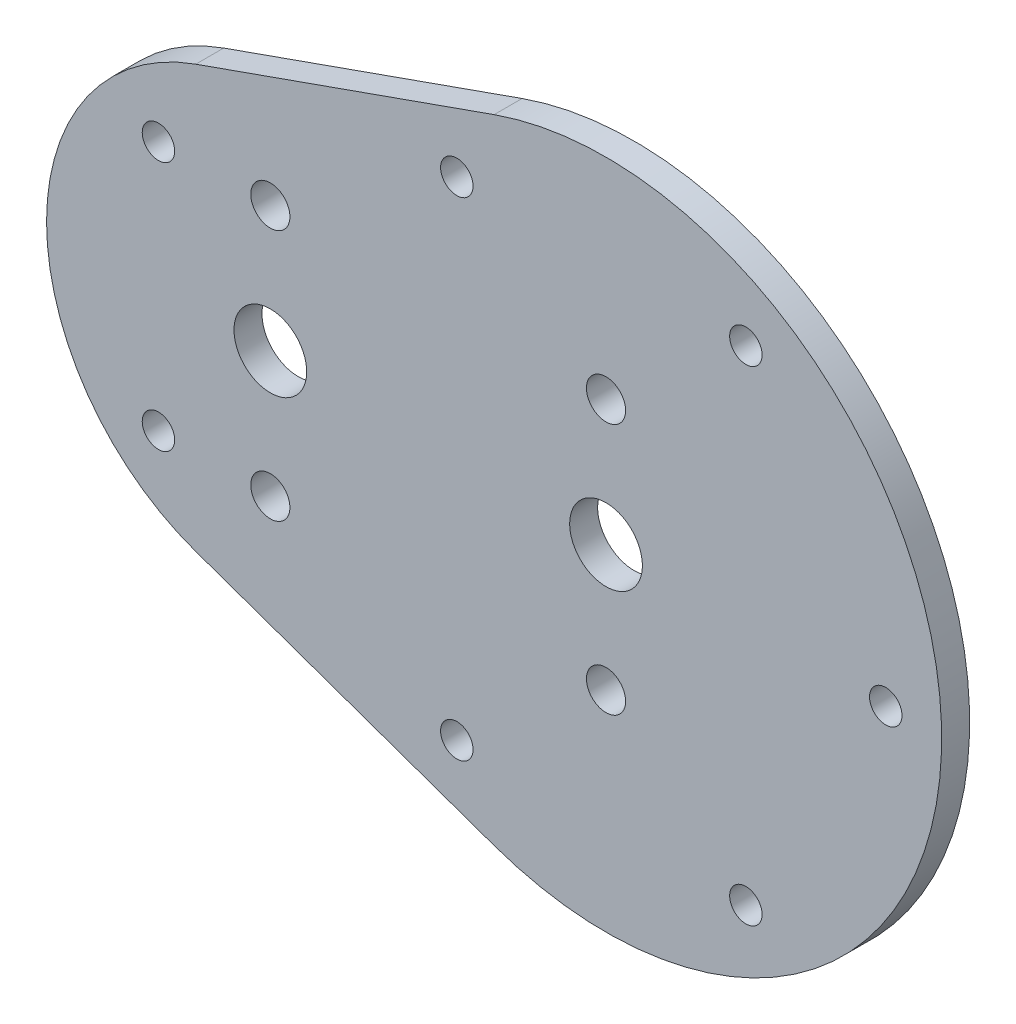
ISO-10303-21;
HEADER;
FILE_DESCRIPTION(('STEP AP214'),'2;1');
FILE_NAME('part.step','',(''),(''),'','','');
FILE_SCHEMA(('AUTOMOTIVE_DESIGN { 1 0 10303 214 1 1 1 1 }'));
ENDSEC;
DATA;
#1=APPLICATION_CONTEXT('core data for automotive mechanical design processes');
#2=APPLICATION_PROTOCOL_DEFINITION('international standard','automotive_design',2000,#1);
#3=PRODUCT_CONTEXT('',#1,'mechanical');
#4=PRODUCT('Part','Part','',(#3));
#5=PRODUCT_RELATED_PRODUCT_CATEGORY('part','',(#4));
#6=PRODUCT_DEFINITION_FORMATION('','',#4);
#7=PRODUCT_DEFINITION_CONTEXT('part definition',#1,'design');
#8=PRODUCT_DEFINITION('design','',#6,#7);
#9=PRODUCT_DEFINITION_SHAPE('','',#8);
#10=(LENGTH_UNIT() NAMED_UNIT(*) SI_UNIT(.MILLI.,.METRE.));
#11=(NAMED_UNIT(*) PLANE_ANGLE_UNIT() SI_UNIT($,.RADIAN.));
#12=(NAMED_UNIT(*) SI_UNIT($,.STERADIAN.) SOLID_ANGLE_UNIT());
#13=UNCERTAINTY_MEASURE_WITH_UNIT(LENGTH_MEASURE(1.E-05),#10,'distance_accuracy_value','');
#14=(GEOMETRIC_REPRESENTATION_CONTEXT(3) GLOBAL_UNCERTAINTY_ASSIGNED_CONTEXT((#13)) GLOBAL_UNIT_ASSIGNED_CONTEXT((#10,
#11,#12)) REPRESENTATION_CONTEXT('',''));
#15=CARTESIAN_POINT('',(0.,0.,0.));
#16=DIRECTION('',(0.,0.,1.));
#17=DIRECTION('',(1.,0.,0.));
#18=AXIS2_PLACEMENT_3D('',#15,#16,#17);
#19=CARTESIAN_POINT('',(0.,0.,0.));
#20=DIRECTION('',(0.,0.,-1.));
#21=DIRECTION('',(-1.,0.,0.));
#22=AXIS2_PLACEMENT_3D('',#19,#20,#21);
#23=PLANE('',#22);
#24=CARTESIAN_POINT('',(4.1286418728248E-13,-1.97423163579395E-12,0.));
#25=DIRECTION('',(0.,0.,-1.));
#26=DIRECTION('',(-1.,0.,0.));
#27=AXIS2_PLACEMENT_3D('',#24,#25,#26);
#28=CIRCLE('',#27,6.49999999999999);
#29=CARTESIAN_POINT('',(4.1286418728248E-13,6.49999999999801,0.));
#30=VERTEX_POINT('',#29);
#31=EDGE_CURVE('E236',#30,#30,#28,.T.);
#32=ORIENTED_EDGE('',*,*,#31,.F.);
#33=EDGE_LOOP('',(#32));
#34=FACE_BOUND('',#33,.T.);
#35=CARTESIAN_POINT('',(-60.0000000000004,-1.97250130139743E-12,0.));
#36=DIRECTION('',(0.,0.,-1.));
#37=DIRECTION('',(-1.,0.,0.));
#38=AXIS2_PLACEMENT_3D('',#35,#36,#37);
#39=CIRCLE('',#38,6.50000000000043);
#40=CARTESIAN_POINT('',(-60.0000000000004,6.49999999999846,0.));
#41=VERTEX_POINT('',#40);
#42=EDGE_CURVE('E142',#41,#41,#39,.T.);
#43=ORIENTED_EDGE('',*,*,#42,.F.);
#44=EDGE_LOOP('',(#43));
#45=FACE_BOUND('',#44,.T.);
#46=CARTESIAN_POINT('',(50.0000000000003,-1.82649830209131E-12,0.));
#47=DIRECTION('',(0.,0.,-1.));
#48=DIRECTION('',(-1.,0.,0.));
#49=AXIS2_PLACEMENT_3D('',#46,#47,#48);
#50=CIRCLE('',#49,2.89999999999993);
#51=CARTESIAN_POINT('',(47.1000000000004,-1.82649830209131E-12,0.));
#52=VERTEX_POINT('',#51);
#53=EDGE_CURVE('E149',#52,#52,#50,.T.);
#54=ORIENTED_EDGE('',*,*,#53,.F.);
#55=EDGE_LOOP('',(#54));
#56=FACE_BOUND('',#55,.T.);
#57=CARTESIAN_POINT('',(24.9999999999992,-43.3012701892219,0.));
#58=DIRECTION('',(0.,0.,-1.));
#59=DIRECTION('',(-1.,0.,0.));
#60=AXIS2_PLACEMENT_3D('',#57,#58,#59);
#61=CIRCLE('',#60,2.89999999999993);
#62=CARTESIAN_POINT('',(22.0999999999993,-43.3012701892219,0.));
#63=VERTEX_POINT('',#62);
#64=EDGE_CURVE('E148',#63,#63,#61,.T.);
#65=ORIENTED_EDGE('',*,*,#64,.F.);
#66=EDGE_LOOP('',(#65));
#67=FACE_BOUND('',#66,.T.);
#68=CARTESIAN_POINT('',(24.9999999999992,43.3012701892183,0.));
#69=DIRECTION('',(0.,0.,-1.));
#70=DIRECTION('',(-1.,0.,0.));
#71=AXIS2_PLACEMENT_3D('',#68,#69,#70);
#72=CIRCLE('',#71,2.89999999999993);
#73=CARTESIAN_POINT('',(22.0999999999993,43.3012701892183,0.));
#74=VERTEX_POINT('',#73);
#75=EDGE_CURVE('E153',#74,#74,#72,.T.);
#76=ORIENTED_EDGE('',*,*,#75,.F.);
#77=EDGE_LOOP('',(#76));
#78=FACE_BOUND('',#77,.T.);
#79=CARTESIAN_POINT('',(-80.0000000000008,-22.3606797749979,0.));
#80=DIRECTION('',(0.,0.,-1.));
#81=DIRECTION('',(-1.,0.,0.));
#82=AXIS2_PLACEMENT_3D('',#79,#80,#81);
#83=CIRCLE('',#82,2.89999999999993);
#84=CARTESIAN_POINT('',(-82.9000000000007,-22.3606797749979,0.));
#85=VERTEX_POINT('',#84);
#86=EDGE_CURVE('E157',#85,#85,#83,.T.);
#87=ORIENTED_EDGE('',*,*,#86,.F.);
#88=EDGE_LOOP('',(#87));
#89=FACE_BOUND('',#88,.T.);
#90=CARTESIAN_POINT('',(-80.0000000000008,22.3606797749942,0.));
#91=DIRECTION('',(0.,0.,-1.));
#92=DIRECTION('',(-1.,0.,0.));
#93=AXIS2_PLACEMENT_3D('',#90,#91,#92);
#94=CIRCLE('',#93,2.89999999999993);
#95=CARTESIAN_POINT('',(-82.9000000000007,22.3606797749942,0.));
#96=VERTEX_POINT('',#95);
#97=EDGE_CURVE('E161',#96,#96,#94,.T.);
#98=ORIENTED_EDGE('',*,*,#97,.F.);
#99=EDGE_LOOP('',(#98));
#100=FACE_BOUND('',#99,.T.);
#101=CARTESIAN_POINT('',(-26.6666666666674,-43.6049181731704,0.));
#102=DIRECTION('',(0.,0.,-1.));
#103=DIRECTION('',(-1.,0.,0.));
#104=AXIS2_PLACEMENT_3D('',#101,#102,#103);
#105=CIRCLE('',#104,2.89999999999993);
#106=CARTESIAN_POINT('',(-29.5666666666674,-43.6049181731704,0.));
#107=VERTEX_POINT('',#106);
#108=EDGE_CURVE('E165',#107,#107,#105,.T.);
#109=ORIENTED_EDGE('',*,*,#108,.F.);
#110=EDGE_LOOP('',(#109));
#111=FACE_BOUND('',#110,.T.);
#112=CARTESIAN_POINT('',(-26.6666666666674,43.6049181731704,0.));
#113=DIRECTION('',(0.,0.,-1.));
#114=DIRECTION('',(-1.,0.,0.));
#115=AXIS2_PLACEMENT_3D('',#112,#113,#114);
#116=CIRCLE('',#115,2.89999999999993);
#117=CARTESIAN_POINT('',(-29.5666666666674,43.6049181731704,0.));
#118=VERTEX_POINT('',#117);
#119=EDGE_CURVE('E169',#118,#118,#116,.T.);
#120=ORIENTED_EDGE('',*,*,#119,.F.);
#121=EDGE_LOOP('',(#120));
#122=FACE_BOUND('',#121,.T.);
#123=CARTESIAN_POINT('',(-59.9999999999996,22.499999999998,0.));
#124=DIRECTION('',(0.,0.,-1.));
#125=DIRECTION('',(-1.,0.,0.));
#126=AXIS2_PLACEMENT_3D('',#123,#124,#125);
#127=CIRCLE('',#126,3.5000000000006);
#128=CARTESIAN_POINT('',(-63.5000000000002,22.499999999998,0.));
#129=VERTEX_POINT('',#128);
#130=EDGE_CURVE('E185',#129,#129,#127,.T.);
#131=ORIENTED_EDGE('',*,*,#130,.F.);
#132=EDGE_LOOP('',(#131));
#133=FACE_BOUND('',#132,.T.);
#134=CARTESIAN_POINT('',(-59.9999999999996,-22.500000000002,0.));
#135=DIRECTION('',(0.,0.,-1.));
#136=DIRECTION('',(-1.,0.,0.));
#137=AXIS2_PLACEMENT_3D('',#134,#135,#136);
#138=CIRCLE('',#137,3.5000000000006);
#139=CARTESIAN_POINT('',(-63.5000000000002,-22.500000000002,0.));
#140=VERTEX_POINT('',#139);
#141=EDGE_CURVE('E181',#140,#140,#138,.T.);
#142=ORIENTED_EDGE('',*,*,#141,.F.);
#143=EDGE_LOOP('',(#142));
#144=FACE_BOUND('',#143,.T.);
#145=CARTESIAN_POINT('',(4.07744003775344E-13,-22.500000000002,0.));
#146=DIRECTION('',(0.,0.,-1.));
#147=DIRECTION('',(-1.,0.,0.));
#148=AXIS2_PLACEMENT_3D('',#145,#146,#147);
#149=CIRCLE('',#148,3.50000000000057);
#150=CARTESIAN_POINT('',(-3.50000000000016,-22.500000000002,0.));
#151=VERTEX_POINT('',#150);
#152=EDGE_CURVE('E177',#151,#151,#149,.T.);
#153=ORIENTED_EDGE('',*,*,#152,.F.);
#154=EDGE_LOOP('',(#153));
#155=FACE_BOUND('',#154,.T.);
#156=CARTESIAN_POINT('',(4.07744003775344E-13,22.499999999998,0.));
#157=DIRECTION('',(0.,0.,-1.));
#158=DIRECTION('',(-1.,0.,0.));
#159=AXIS2_PLACEMENT_3D('',#156,#157,#158);
#160=CIRCLE('',#159,3.50000000000058);
#161=CARTESIAN_POINT('',(-3.50000000000017,22.499999999998,0.));
#162=VERTEX_POINT('',#161);
#163=EDGE_CURVE('E173',#162,#162,#160,.T.);
#164=ORIENTED_EDGE('',*,*,#163,.F.);
#165=EDGE_LOOP('',(#164));
#166=FACE_BOUND('',#165,.T.);
#167=DIRECTION('',(-0.942809041582063,-0.333333333333333,0.));
#168=VECTOR('',#167,1.);
#169=CARTESIAN_POINT('',(-20.,56.5685424949238,0.));
#170=LINE('',#169,#168);
#171=CARTESIAN_POINT('',(-20.,56.5685424949238,0.));
#172=VERTEX_POINT('',#171);
#173=CARTESIAN_POINT('',(-73.3333333333333,37.7123616632826,0.));
#174=VERTEX_POINT('',#173);
#175=EDGE_CURVE('E191',#172,#174,#170,.T.);
#176=ORIENTED_EDGE('',*,*,#175,.F.);
#177=CARTESIAN_POINT('',(0.,0.,0.));
#178=DIRECTION('',(0.,0.,1.));
#179=DIRECTION('',(1.,0.,0.));
#180=AXIS2_PLACEMENT_3D('',#177,#178,#179);
#181=CIRCLE('',#180,60.);
#182=CARTESIAN_POINT('',(-20.,-56.5685424949238,0.));
#183=VERTEX_POINT('',#182);
#184=EDGE_CURVE('E81',#183,#172,#181,.T.);
#185=ORIENTED_EDGE('',*,*,#184,.F.);
#186=DIRECTION('',(0.942809041582063,-0.333333333333333,0.));
#187=VECTOR('',#186,1.);
#188=CARTESIAN_POINT('',(-73.3333333333333,-37.7123616632825,0.));
#189=LINE('',#188,#187);
#190=CARTESIAN_POINT('',(-73.3333333333333,-37.7123616632825,0.));
#191=VERTEX_POINT('',#190);
#192=EDGE_CURVE('E200',#191,#183,#189,.T.);
#193=ORIENTED_EDGE('',*,*,#192,.F.);
#194=CARTESIAN_POINT('',(-60.,0.,0.));
#195=DIRECTION('',(0.,0.,-1.));
#196=DIRECTION('',(-1.,0.,0.));
#197=AXIS2_PLACEMENT_3D('',#194,#195,#196);
#198=CIRCLE('',#197,40.);
#199=EDGE_CURVE('E202',#191,#174,#198,.T.);
#200=ORIENTED_EDGE('',*,*,#199,.T.);
#201=EDGE_LOOP('',(#176,#185,#193,#200));
#202=FACE_BOUND('',#201,.T.);
#203=DIRECTION('',(0.,1.,0.));
#204=VECTOR('',#203,1.);
#205=CARTESIAN_POINT('',(39.6862696659694,0.,0.));
#206=LINE('',#205,#204);
#207=CARTESIAN_POINT('',(39.6862696659694,-37.5000000000018,0.));
#208=VERTEX_POINT('',#207);
#209=CARTESIAN_POINT('',(39.6862696659694,37.4999999999982,0.));
#210=VERTEX_POINT('',#209);
#211=EDGE_CURVE('E45',#208,#210,#206,.T.);
#212=ORIENTED_EDGE('',*,*,#211,.T.);
#213=DIRECTION('',(-1.,0.,0.));
#214=VECTOR('',#213,1.);
#215=CARTESIAN_POINT('',(0.,37.4999999999982,0.));
#216=LINE('',#215,#214);
#217=CARTESIAN_POINT('',(35.6862696659694,37.4999999999982,0.));
#218=VERTEX_POINT('',#217);
#219=EDGE_CURVE('E12',#210,#218,#216,.T.);
#220=ORIENTED_EDGE('',*,*,#219,.T.);
#221=DIRECTION('',(0.,-1.,0.));
#222=VECTOR('',#221,1.);
#223=CARTESIAN_POINT('',(35.6862696659694,0.,0.));
#224=LINE('',#223,#222);
#225=CARTESIAN_POINT('',(35.6862696659694,-37.5000000000018,0.));
#226=VERTEX_POINT('',#225);
#227=EDGE_CURVE('E208',#218,#226,#224,.T.);
#228=ORIENTED_EDGE('',*,*,#227,.T.);
#229=DIRECTION('',(1.,0.,0.));
#230=VECTOR('',#229,1.);
#231=CARTESIAN_POINT('',(0.,-37.5000000000018,0.));
#232=LINE('',#231,#230);
#233=EDGE_CURVE('E243',#226,#208,#232,.T.);
#234=ORIENTED_EDGE('',*,*,#233,.T.);
#235=EDGE_LOOP('',(#212,#220,#228,#234));
#236=FACE_BOUND('',#235,.T.);
#237=ADVANCED_FACE('F37',(#34,#45,#56,#67,#78,#89,#100,#111,#122,#133,#144,#155,#166,#202,#236),
#23,.T.);
#238=CARTESIAN_POINT('',(-20.,56.5685424949238,5.));
#239=DIRECTION('',(0.333333333333333,-0.942809041582063,0.));
#240=DIRECTION('',(0.942809041582064,0.333333333333333,0.));
#241=AXIS2_PLACEMENT_3D('',#238,#239,#240);
#242=PLANE('',#241);
#243=ORIENTED_EDGE('',*,*,#175,.T.);
#244=DIRECTION('',(0.,0.,-1.));
#245=VECTOR('',#244,1.);
#246=CARTESIAN_POINT('',(-73.3333333333333,37.7123616632826,5.));
#247=LINE('',#246,#245);
#248=CARTESIAN_POINT('',(-73.3333333333333,37.7123616632826,5.));
#249=VERTEX_POINT('',#248);
#250=EDGE_CURVE('E209',#249,#174,#247,.T.);
#251=ORIENTED_EDGE('',*,*,#250,.F.);
#252=DIRECTION('',(-0.942809041582063,-0.333333333333333,0.));
#253=VECTOR('',#252,1.);
#254=CARTESIAN_POINT('',(-20.,56.5685424949238,5.));
#255=LINE('',#254,#253);
#256=CARTESIAN_POINT('',(-20.,56.5685424949238,5.));
#257=VERTEX_POINT('',#256);
#258=EDGE_CURVE('E196',#257,#249,#255,.T.);
#259=ORIENTED_EDGE('',*,*,#258,.F.);
#260=DIRECTION('',(0.,0.,-1.));
#261=VECTOR('',#260,1.);
#262=CARTESIAN_POINT('',(-20.,56.5685424949238,5.));
#263=LINE('',#262,#261);
#264=EDGE_CURVE('E61',#257,#172,#263,.T.);
#265=ORIENTED_EDGE('',*,*,#264,.T.);
#266=EDGE_LOOP('',(#243,#251,#259,#265));
#267=FACE_BOUND('',#266,.T.);
#268=ADVANCED_FACE('F258',(#267),#242,.F.);
#269=CARTESIAN_POINT('',(-60.,0.,5.));
#270=DIRECTION('',(0.,0.,-1.));
#271=DIRECTION('',(-1.,0.,0.));
#272=AXIS2_PLACEMENT_3D('',#269,#270,#271);
#273=CYLINDRICAL_SURFACE('',#272,40.);
#274=ORIENTED_EDGE('',*,*,#199,.F.);
#275=DIRECTION('',(0.,0.,-1.));
#276=VECTOR('',#275,1.);
#277=CARTESIAN_POINT('',(-73.3333333333333,-37.7123616632825,5.));
#278=LINE('',#277,#276);
#279=CARTESIAN_POINT('',(-73.3333333333333,-37.7123616632825,5.));
#280=VERTEX_POINT('',#279);
#281=EDGE_CURVE('E211',#280,#191,#278,.T.);
#282=ORIENTED_EDGE('',*,*,#281,.F.);
#283=CARTESIAN_POINT('',(-60.,0.,5.));
#284=DIRECTION('',(0.,0.,-1.));
#285=DIRECTION('',(-1.,0.,0.));
#286=AXIS2_PLACEMENT_3D('',#283,#284,#285);
#287=CIRCLE('',#286,40.);
#288=EDGE_CURVE('E193',#280,#249,#287,.T.);
#289=ORIENTED_EDGE('',*,*,#288,.T.);
#290=ORIENTED_EDGE('',*,*,#250,.T.);
#291=EDGE_LOOP('',(#274,#282,#289,#290));
#292=FACE_BOUND('',#291,.T.);
#293=ADVANCED_FACE('F266',(#292),#273,.T.);
#294=CARTESIAN_POINT('',(-73.3333333333333,-37.7123616632825,5.));
#295=DIRECTION('',(0.333333333333333,0.942809041582063,0.));
#296=DIRECTION('',(-0.942809041582064,0.333333333333333,0.));
#297=AXIS2_PLACEMENT_3D('',#294,#295,#296);
#298=PLANE('',#297);
#299=ORIENTED_EDGE('',*,*,#192,.T.);
#300=DIRECTION('',(0.,0.,-1.));
#301=VECTOR('',#300,1.);
#302=CARTESIAN_POINT('',(-20.,-56.5685424949238,5.));
#303=LINE('',#302,#301);
#304=CARTESIAN_POINT('',(-20.,-56.5685424949238,5.));
#305=VERTEX_POINT('',#304);
#306=EDGE_CURVE('E198',#305,#183,#303,.T.);
#307=ORIENTED_EDGE('',*,*,#306,.F.);
#308=DIRECTION('',(0.942809041582063,-0.333333333333333,0.));
#309=VECTOR('',#308,1.);
#310=CARTESIAN_POINT('',(-73.3333333333333,-37.7123616632825,5.));
#311=LINE('',#310,#309);
#312=EDGE_CURVE('E190',#280,#305,#311,.T.);
#313=ORIENTED_EDGE('',*,*,#312,.F.);
#314=ORIENTED_EDGE('',*,*,#281,.T.);
#315=EDGE_LOOP('',(#299,#307,#313,#314));
#316=FACE_BOUND('',#315,.T.);
#317=ADVANCED_FACE('F276',(#316),#298,.F.);
#318=CARTESIAN_POINT('',(0.,0.,5.));
#319=DIRECTION('',(0.,0.,-1.));
#320=DIRECTION('',(-1.,0.,0.));
#321=AXIS2_PLACEMENT_3D('',#318,#319,#320);
#322=CYLINDRICAL_SURFACE('',#321,60.);
#323=ORIENTED_EDGE('',*,*,#184,.T.);
#324=ORIENTED_EDGE('',*,*,#264,.F.);
#325=CARTESIAN_POINT('',(0.,0.,5.));
#326=DIRECTION('',(0.,0.,-1.));
#327=DIRECTION('',(-1.,0.,0.));
#328=AXIS2_PLACEMENT_3D('',#325,#326,#327);
#329=CIRCLE('',#328,60.);
#330=EDGE_CURVE('E84',#257,#305,#329,.T.);
#331=ORIENTED_EDGE('',*,*,#330,.T.);
#332=ORIENTED_EDGE('',*,*,#306,.T.);
#333=EDGE_LOOP('',(#323,#324,#331,#332));
#334=FACE_BOUND('',#333,.T.);
#335=ADVANCED_FACE('F39',(#334),#322,.T.);
#336=CARTESIAN_POINT('',(0.,0.,5.));
#337=DIRECTION('',(0.,0.,-1.));
#338=DIRECTION('',(-1.,0.,0.));
#339=AXIS2_PLACEMENT_3D('',#336,#337,#338);
#340=PLANE('',#339);
#341=CARTESIAN_POINT('',(4.1286418728248E-13,-1.97424017550411E-12,5.));
#342=DIRECTION('',(0.,0.,-1.));
#343=DIRECTION('',(0.,1.,0.));
#344=AXIS2_PLACEMENT_3D('',#341,#342,#343);
#345=CIRCLE('',#344,6.49999999999999);
#346=CARTESIAN_POINT('',(4.1286418728248E-13,6.49999999999801,5.));
#347=VERTEX_POINT('',#346);
#348=EDGE_CURVE('E139',#347,#347,#345,.T.);
#349=ORIENTED_EDGE('',*,*,#348,.T.);
#350=EDGE_LOOP('',(#349));
#351=FACE_BOUND('',#350,.T.);
#352=CARTESIAN_POINT('',(-60.0000000000004,-1.97250984110758E-12,5.));
#353=DIRECTION('',(0.,0.,-1.));
#354=DIRECTION('',(0.,1.,0.));
#355=AXIS2_PLACEMENT_3D('',#352,#353,#354);
#356=CIRCLE('',#355,6.50000000000043);
#357=CARTESIAN_POINT('',(-60.0000000000004,6.49999999999846,5.));
#358=VERTEX_POINT('',#357);
#359=EDGE_CURVE('E137',#358,#358,#356,.T.);
#360=ORIENTED_EDGE('',*,*,#359,.T.);
#361=EDGE_LOOP('',(#360));
#362=FACE_BOUND('',#361,.T.);
#363=CARTESIAN_POINT('',(50.0000000000003,-1.82649830209131E-12,5.));
#364=DIRECTION('',(0.,0.,-1.));
#365=DIRECTION('',(-1.,0.,0.));
#366=AXIS2_PLACEMENT_3D('',#363,#364,#365);
#367=CIRCLE('',#366,2.89999999999993);
#368=CARTESIAN_POINT('',(47.1000000000004,-1.82649830209131E-12,5.));
#369=VERTEX_POINT('',#368);
#370=EDGE_CURVE('E145',#369,#369,#367,.T.);
#371=ORIENTED_EDGE('',*,*,#370,.T.);
#372=EDGE_LOOP('',(#371));
#373=FACE_BOUND('',#372,.T.);
#374=CARTESIAN_POINT('',(24.9999999999992,-43.3012701892219,5.));
#375=DIRECTION('',(0.,0.,-1.));
#376=DIRECTION('',(-1.,0.,0.));
#377=AXIS2_PLACEMENT_3D('',#374,#375,#376);
#378=CIRCLE('',#377,2.89999999999993);
#379=CARTESIAN_POINT('',(22.0999999999993,-43.3012701892219,5.));
#380=VERTEX_POINT('',#379);
#381=EDGE_CURVE('E150',#380,#380,#378,.T.);
#382=ORIENTED_EDGE('',*,*,#381,.T.);
#383=EDGE_LOOP('',(#382));
#384=FACE_BOUND('',#383,.T.);
#385=CARTESIAN_POINT('',(24.9999999999992,43.3012701892183,5.));
#386=DIRECTION('',(0.,0.,-1.));
#387=DIRECTION('',(-1.,0.,0.));
#388=AXIS2_PLACEMENT_3D('',#385,#386,#387);
#389=CIRCLE('',#388,2.89999999999993);
#390=CARTESIAN_POINT('',(22.0999999999993,43.3012701892183,5.));
#391=VERTEX_POINT('',#390);
#392=EDGE_CURVE('E154',#391,#391,#389,.T.);
#393=ORIENTED_EDGE('',*,*,#392,.T.);
#394=EDGE_LOOP('',(#393));
#395=FACE_BOUND('',#394,.T.);
#396=CARTESIAN_POINT('',(-80.0000000000008,-22.3606797749979,5.));
#397=DIRECTION('',(0.,0.,-1.));
#398=DIRECTION('',(-1.,0.,0.));
#399=AXIS2_PLACEMENT_3D('',#396,#397,#398);
#400=CIRCLE('',#399,2.89999999999993);
#401=CARTESIAN_POINT('',(-82.9000000000007,-22.3606797749979,5.));
#402=VERTEX_POINT('',#401);
#403=EDGE_CURVE('E158',#402,#402,#400,.T.);
#404=ORIENTED_EDGE('',*,*,#403,.T.);
#405=EDGE_LOOP('',(#404));
#406=FACE_BOUND('',#405,.T.);
#407=CARTESIAN_POINT('',(-80.0000000000008,22.3606797749942,5.));
#408=DIRECTION('',(0.,0.,-1.));
#409=DIRECTION('',(-1.,0.,0.));
#410=AXIS2_PLACEMENT_3D('',#407,#408,#409);
#411=CIRCLE('',#410,2.89999999999993);
#412=CARTESIAN_POINT('',(-82.9000000000007,22.3606797749942,5.));
#413=VERTEX_POINT('',#412);
#414=EDGE_CURVE('E162',#413,#413,#411,.T.);
#415=ORIENTED_EDGE('',*,*,#414,.T.);
#416=EDGE_LOOP('',(#415));
#417=FACE_BOUND('',#416,.T.);
#418=CARTESIAN_POINT('',(-26.6666666666674,-43.6049181731704,5.));
#419=DIRECTION('',(0.,0.,-1.));
#420=DIRECTION('',(-1.,0.,0.));
#421=AXIS2_PLACEMENT_3D('',#418,#419,#420);
#422=CIRCLE('',#421,2.89999999999993);
#423=CARTESIAN_POINT('',(-29.5666666666674,-43.6049181731704,5.));
#424=VERTEX_POINT('',#423);
#425=EDGE_CURVE('E166',#424,#424,#422,.T.);
#426=ORIENTED_EDGE('',*,*,#425,.T.);
#427=EDGE_LOOP('',(#426));
#428=FACE_BOUND('',#427,.T.);
#429=CARTESIAN_POINT('',(-26.6666666666674,43.6049181731704,5.));
#430=DIRECTION('',(0.,0.,-1.));
#431=DIRECTION('',(-1.,0.,0.));
#432=AXIS2_PLACEMENT_3D('',#429,#430,#431);
#433=CIRCLE('',#432,2.89999999999993);
#434=CARTESIAN_POINT('',(-29.5666666666674,43.6049181731704,5.));
#435=VERTEX_POINT('',#434);
#436=EDGE_CURVE('E170',#435,#435,#433,.T.);
#437=ORIENTED_EDGE('',*,*,#436,.T.);
#438=EDGE_LOOP('',(#437));
#439=FACE_BOUND('',#438,.T.);
#440=CARTESIAN_POINT('',(-59.9999999999996,22.499999999998,5.));
#441=DIRECTION('',(0.,0.,-1.));
#442=DIRECTION('',(-1.,0.,0.));
#443=AXIS2_PLACEMENT_3D('',#440,#441,#442);
#444=CIRCLE('',#443,3.5000000000006);
#445=CARTESIAN_POINT('',(-63.5000000000002,22.499999999998,5.));
#446=VERTEX_POINT('',#445);
#447=EDGE_CURVE('E186',#446,#446,#444,.T.);
#448=ORIENTED_EDGE('',*,*,#447,.T.);
#449=EDGE_LOOP('',(#448));
#450=FACE_BOUND('',#449,.T.);
#451=CARTESIAN_POINT('',(-59.9999999999996,-22.500000000002,5.));
#452=DIRECTION('',(0.,0.,-1.));
#453=DIRECTION('',(-1.,0.,0.));
#454=AXIS2_PLACEMENT_3D('',#451,#452,#453);
#455=CIRCLE('',#454,3.5000000000006);
#456=CARTESIAN_POINT('',(-63.5000000000002,-22.500000000002,5.));
#457=VERTEX_POINT('',#456);
#458=EDGE_CURVE('E182',#457,#457,#455,.T.);
#459=ORIENTED_EDGE('',*,*,#458,.T.);
#460=EDGE_LOOP('',(#459));
#461=FACE_BOUND('',#460,.T.);
#462=CARTESIAN_POINT('',(4.0782035552152E-13,-22.500000000002,5.));
#463=DIRECTION('',(0.,0.,-1.));
#464=DIRECTION('',(-1.,0.,0.));
#465=AXIS2_PLACEMENT_3D('',#462,#463,#464);
#466=CIRCLE('',#465,3.50000000000057);
#467=CARTESIAN_POINT('',(-3.50000000000016,-22.500000000002,5.));
#468=VERTEX_POINT('',#467);
#469=EDGE_CURVE('E178',#468,#468,#466,.T.);
#470=ORIENTED_EDGE('',*,*,#469,.T.);
#471=EDGE_LOOP('',(#470));
#472=FACE_BOUND('',#471,.T.);
#473=CARTESIAN_POINT('',(4.0782035552152E-13,22.499999999998,5.));
#474=DIRECTION('',(0.,0.,-1.));
#475=DIRECTION('',(-1.,0.,0.));
#476=AXIS2_PLACEMENT_3D('',#473,#474,#475);
#477=CIRCLE('',#476,3.50000000000058);
#478=CARTESIAN_POINT('',(-3.50000000000017,22.499999999998,5.));
#479=VERTEX_POINT('',#478);
#480=EDGE_CURVE('E174',#479,#479,#477,.T.);
#481=ORIENTED_EDGE('',*,*,#480,.T.);
#482=EDGE_LOOP('',(#481));
#483=FACE_BOUND('',#482,.T.);
#484=ORIENTED_EDGE('',*,*,#330,.F.);
#485=ORIENTED_EDGE('',*,*,#258,.T.);
#486=ORIENTED_EDGE('',*,*,#288,.F.);
#487=ORIENTED_EDGE('',*,*,#312,.T.);
#488=EDGE_LOOP('',(#484,#485,#486,#487));
#489=FACE_BOUND('',#488,.T.);
#490=ADVANCED_FACE('F272',(#351,#362,#373,#384,#395,#406,#417,#428,#439,#450,#461,#472,#483,
#489),#340,.F.);
#491=CARTESIAN_POINT('',(4.07744003775344E-13,22.499999999998,0.));
#492=DIRECTION('',(0.,0.,-1.));
#493=DIRECTION('',(-1.,0.,0.));
#494=AXIS2_PLACEMENT_3D('',#491,#492,#493);
#495=CYLINDRICAL_SURFACE('',#494,3.50000000000058);
#496=ORIENTED_EDGE('',*,*,#163,.T.);
#497=EDGE_LOOP('',(#496));
#498=FACE_BOUND('',#497,.T.);
#499=ORIENTED_EDGE('',*,*,#480,.F.);
#500=EDGE_LOOP('',(#499));
#501=FACE_BOUND('',#500,.T.);
#502=ADVANCED_FACE('F293',(#498,#501),#495,.F.);
#503=CARTESIAN_POINT('',(4.07744003775344E-13,-22.500000000002,0.));
#504=DIRECTION('',(0.,0.,-1.));
#505=DIRECTION('',(-1.,0.,0.));
#506=AXIS2_PLACEMENT_3D('',#503,#504,#505);
#507=CYLINDRICAL_SURFACE('',#506,3.50000000000057);
#508=ORIENTED_EDGE('',*,*,#152,.T.);
#509=EDGE_LOOP('',(#508));
#510=FACE_BOUND('',#509,.T.);
#511=ORIENTED_EDGE('',*,*,#469,.F.);
#512=EDGE_LOOP('',(#511));
#513=FACE_BOUND('',#512,.T.);
#514=ADVANCED_FACE('F300',(#510,#513),#507,.F.);
#515=CARTESIAN_POINT('',(-59.9999999999996,-22.500000000002,0.));
#516=DIRECTION('',(0.,0.,-1.));
#517=DIRECTION('',(-1.,0.,0.));
#518=AXIS2_PLACEMENT_3D('',#515,#516,#517);
#519=CYLINDRICAL_SURFACE('',#518,3.5000000000006);
#520=ORIENTED_EDGE('',*,*,#141,.T.);
#521=EDGE_LOOP('',(#520));
#522=FACE_BOUND('',#521,.T.);
#523=ORIENTED_EDGE('',*,*,#458,.F.);
#524=EDGE_LOOP('',(#523));
#525=FACE_BOUND('',#524,.T.);
#526=ADVANCED_FACE('F330',(#522,#525),#519,.F.);
#527=CARTESIAN_POINT('',(-59.9999999999996,22.499999999998,0.));
#528=DIRECTION('',(0.,0.,-1.));
#529=DIRECTION('',(-1.,0.,0.));
#530=AXIS2_PLACEMENT_3D('',#527,#528,#529);
#531=CYLINDRICAL_SURFACE('',#530,3.5000000000006);
#532=ORIENTED_EDGE('',*,*,#130,.T.);
#533=EDGE_LOOP('',(#532));
#534=FACE_BOUND('',#533,.T.);
#535=ORIENTED_EDGE('',*,*,#447,.F.);
#536=EDGE_LOOP('',(#535));
#537=FACE_BOUND('',#536,.T.);
#538=ADVANCED_FACE('F336',(#534,#537),#531,.F.);
#539=CARTESIAN_POINT('',(-26.6666666666674,43.6049181731704,47.9999999999999));
#540=DIRECTION('',(0.,0.,1.));
#541=DIRECTION('',(1.,0.,0.));
#542=AXIS2_PLACEMENT_3D('',#539,#540,#541);
#543=CYLINDRICAL_SURFACE('',#542,2.89999999999993);
#544=ORIENTED_EDGE('',*,*,#119,.T.);
#545=EDGE_LOOP('',(#544));
#546=FACE_BOUND('',#545,.T.);
#547=ORIENTED_EDGE('',*,*,#436,.F.);
#548=EDGE_LOOP('',(#547));
#549=FACE_BOUND('',#548,.T.);
#550=ADVANCED_FACE('F340',(#546,#549),#543,.F.);
#551=CARTESIAN_POINT('',(-26.6666666666674,-43.6049181731704,47.9999999999999));
#552=DIRECTION('',(0.,0.,1.));
#553=DIRECTION('',(1.,0.,0.));
#554=AXIS2_PLACEMENT_3D('',#551,#552,#553);
#555=CYLINDRICAL_SURFACE('',#554,2.89999999999993);
#556=ORIENTED_EDGE('',*,*,#108,.T.);
#557=EDGE_LOOP('',(#556));
#558=FACE_BOUND('',#557,.T.);
#559=ORIENTED_EDGE('',*,*,#425,.F.);
#560=EDGE_LOOP('',(#559));
#561=FACE_BOUND('',#560,.T.);
#562=ADVANCED_FACE('F349',(#558,#561),#555,.F.);
#563=CARTESIAN_POINT('',(-80.0000000000008,22.3606797749942,47.9999999999999));
#564=DIRECTION('',(0.,0.,1.));
#565=DIRECTION('',(1.,0.,0.));
#566=AXIS2_PLACEMENT_3D('',#563,#564,#565);
#567=CYLINDRICAL_SURFACE('',#566,2.89999999999993);
#568=ORIENTED_EDGE('',*,*,#97,.T.);
#569=EDGE_LOOP('',(#568));
#570=FACE_BOUND('',#569,.T.);
#571=ORIENTED_EDGE('',*,*,#414,.F.);
#572=EDGE_LOOP('',(#571));
#573=FACE_BOUND('',#572,.T.);
#574=ADVANCED_FACE('F364',(#570,#573),#567,.F.);
#575=CARTESIAN_POINT('',(-80.0000000000008,-22.3606797749979,47.9999999999999));
#576=DIRECTION('',(0.,0.,1.));
#577=DIRECTION('',(1.,0.,0.));
#578=AXIS2_PLACEMENT_3D('',#575,#576,#577);
#579=CYLINDRICAL_SURFACE('',#578,2.89999999999993);
#580=ORIENTED_EDGE('',*,*,#86,.T.);
#581=EDGE_LOOP('',(#580));
#582=FACE_BOUND('',#581,.T.);
#583=ORIENTED_EDGE('',*,*,#403,.F.);
#584=EDGE_LOOP('',(#583));
#585=FACE_BOUND('',#584,.T.);
#586=ADVANCED_FACE('F372',(#582,#585),#579,.F.);
#587=CARTESIAN_POINT('',(24.9999999999992,43.3012701892183,47.9999999999999));
#588=DIRECTION('',(0.,0.,1.));
#589=DIRECTION('',(1.,0.,0.));
#590=AXIS2_PLACEMENT_3D('',#587,#588,#589);
#591=CYLINDRICAL_SURFACE('',#590,2.89999999999993);
#592=ORIENTED_EDGE('',*,*,#75,.T.);
#593=EDGE_LOOP('',(#592));
#594=FACE_BOUND('',#593,.T.);
#595=ORIENTED_EDGE('',*,*,#392,.F.);
#596=EDGE_LOOP('',(#595));
#597=FACE_BOUND('',#596,.T.);
#598=ADVANCED_FACE('F379',(#594,#597),#591,.F.);
#599=CARTESIAN_POINT('',(24.9999999999992,-43.3012701892219,47.9999999999999));
#600=DIRECTION('',(0.,0.,1.));
#601=DIRECTION('',(1.,0.,0.));
#602=AXIS2_PLACEMENT_3D('',#599,#600,#601);
#603=CYLINDRICAL_SURFACE('',#602,2.89999999999993);
#604=ORIENTED_EDGE('',*,*,#64,.T.);
#605=EDGE_LOOP('',(#604));
#606=FACE_BOUND('',#605,.T.);
#607=ORIENTED_EDGE('',*,*,#381,.F.);
#608=EDGE_LOOP('',(#607));
#609=FACE_BOUND('',#608,.T.);
#610=ADVANCED_FACE('F383',(#606,#609),#603,.F.);
#611=CARTESIAN_POINT('',(50.0000000000003,-1.82649830209131E-12,47.9999999999999));
#612=DIRECTION('',(0.,0.,1.));
#613=DIRECTION('',(1.,0.,0.));
#614=AXIS2_PLACEMENT_3D('',#611,#612,#613);
#615=CYLINDRICAL_SURFACE('',#614,2.89999999999993);
#616=ORIENTED_EDGE('',*,*,#53,.T.);
#617=EDGE_LOOP('',(#616));
#618=FACE_BOUND('',#617,.T.);
#619=ORIENTED_EDGE('',*,*,#370,.F.);
#620=EDGE_LOOP('',(#619));
#621=FACE_BOUND('',#620,.T.);
#622=ADVANCED_FACE('F387',(#618,#621),#615,.F.);
#623=CARTESIAN_POINT('',(-60.0000000000004,-1.97250984110758E-12,5.));
#624=DIRECTION('',(0.,0.,-1.));
#625=DIRECTION('',(0.,1.,0.));
#626=AXIS2_PLACEMENT_3D('',#623,#624,#625);
#627=CYLINDRICAL_SURFACE('',#626,6.50000000000043);
#628=CARTESIAN_POINT('',(-60.0000000000004,6.49999999999846,0.));
#629=CARTESIAN_POINT('',(-60.0000000000004,6.49999999999846,0.0520833333333342));
#630=CARTESIAN_POINT('',(-60.0000000000004,6.49999999999846,0.104166666666668));
#631=CARTESIAN_POINT('',(-60.0000000000004,6.49999999999846,0.208333333333334));
#632=CARTESIAN_POINT('',(-60.0000000000004,6.49999999999846,0.260416666666668));
#633=CARTESIAN_POINT('',(-60.0000000000004,6.49999999999846,0.364583333333334));
#634=CARTESIAN_POINT('',(-60.0000000000004,6.49999999999846,0.416666666666668));
#635=CARTESIAN_POINT('',(-60.0000000000004,6.49999999999846,0.520833333333335));
#636=CARTESIAN_POINT('',(-60.0000000000004,6.49999999999846,0.572916666666668));
#637=CARTESIAN_POINT('',(-60.0000000000004,6.49999999999846,0.677083333333335));
#638=CARTESIAN_POINT('',(-60.0000000000004,6.49999999999846,0.729166666666668));
#639=CARTESIAN_POINT('',(-60.0000000000004,6.49999999999846,0.833333333333335));
#640=CARTESIAN_POINT('',(-60.0000000000004,6.49999999999846,0.885416666666668));
#641=CARTESIAN_POINT('',(-60.0000000000004,6.49999999999846,0.989583333333335));
#642=CARTESIAN_POINT('',(-60.0000000000004,6.49999999999846,1.04166666666667));
#643=CARTESIAN_POINT('',(-60.0000000000004,6.49999999999846,1.14583333333334));
#644=CARTESIAN_POINT('',(-60.0000000000004,6.49999999999846,1.19791666666667));
#645=CARTESIAN_POINT('',(-60.0000000000004,6.49999999999846,1.30208333333334));
#646=CARTESIAN_POINT('',(-60.0000000000004,6.49999999999846,1.35416666666667));
#647=CARTESIAN_POINT('',(-60.0000000000004,6.49999999999846,1.45833333333334));
#648=CARTESIAN_POINT('',(-60.0000000000004,6.49999999999846,1.51041666666667));
#649=CARTESIAN_POINT('',(-60.0000000000004,6.49999999999846,1.61458333333334));
#650=CARTESIAN_POINT('',(-60.0000000000004,6.49999999999846,1.66666666666667));
#651=CARTESIAN_POINT('',(-60.0000000000004,6.49999999999846,1.77083333333334));
#652=CARTESIAN_POINT('',(-60.0000000000004,6.49999999999846,1.82291666666667));
#653=CARTESIAN_POINT('',(-60.0000000000004,6.49999999999846,1.92708333333334));
#654=CARTESIAN_POINT('',(-60.0000000000004,6.49999999999846,1.97916666666667));
#655=CARTESIAN_POINT('',(-60.0000000000004,6.49999999999846,2.08333333333334));
#656=CARTESIAN_POINT('',(-60.0000000000004,6.49999999999846,2.13541666666667));
#657=CARTESIAN_POINT('',(-60.0000000000004,6.49999999999846,2.23958333333334));
#658=CARTESIAN_POINT('',(-60.0000000000004,6.49999999999846,2.29166666666667));
#659=CARTESIAN_POINT('',(-60.0000000000004,6.49999999999846,2.39583333333334));
#660=CARTESIAN_POINT('',(-60.0000000000004,6.49999999999846,2.44791666666667));
#661=CARTESIAN_POINT('',(-60.0000000000004,6.49999999999846,2.55208333333334));
#662=CARTESIAN_POINT('',(-60.0000000000004,6.49999999999846,2.60416666666667));
#663=CARTESIAN_POINT('',(-60.0000000000004,6.49999999999846,2.70833333333334));
#664=CARTESIAN_POINT('',(-60.0000000000004,6.49999999999846,2.76041666666667));
#665=CARTESIAN_POINT('',(-60.0000000000004,6.49999999999846,2.86458333333334));
#666=CARTESIAN_POINT('',(-60.0000000000004,6.49999999999846,2.91666666666667));
#667=CARTESIAN_POINT('',(-60.0000000000004,6.49999999999846,3.02083333333334));
#668=CARTESIAN_POINT('',(-60.0000000000004,6.49999999999846,3.07291666666667));
#669=CARTESIAN_POINT('',(-60.0000000000004,6.49999999999846,3.17708333333334));
#670=CARTESIAN_POINT('',(-60.0000000000004,6.49999999999846,3.22916666666667));
#671=CARTESIAN_POINT('',(-60.0000000000004,6.49999999999846,3.33333333333334));
#672=CARTESIAN_POINT('',(-60.0000000000004,6.49999999999846,3.38541666666667));
#673=CARTESIAN_POINT('',(-60.0000000000004,6.49999999999846,3.48958333333334));
#674=CARTESIAN_POINT('',(-60.0000000000004,6.49999999999846,3.54166666666667));
#675=CARTESIAN_POINT('',(-60.0000000000004,6.49999999999846,3.64583333333334));
#676=CARTESIAN_POINT('',(-60.0000000000004,6.49999999999846,3.69791666666667));
#677=CARTESIAN_POINT('',(-60.0000000000004,6.49999999999846,3.80208333333334));
#678=CARTESIAN_POINT('',(-60.0000000000004,6.49999999999846,3.85416666666667));
#679=CARTESIAN_POINT('',(-60.0000000000004,6.49999999999846,3.95833333333334));
#680=CARTESIAN_POINT('',(-60.0000000000004,6.49999999999846,4.01041666666667));
#681=CARTESIAN_POINT('',(-60.0000000000004,6.49999999999846,4.11458333333334));
#682=CARTESIAN_POINT('',(-60.0000000000004,6.49999999999846,4.16666666666667));
#683=CARTESIAN_POINT('',(-60.0000000000004,6.49999999999846,4.27083333333334));
#684=CARTESIAN_POINT('',(-60.0000000000004,6.49999999999846,4.32291666666667));
#685=CARTESIAN_POINT('',(-60.0000000000004,6.49999999999846,4.42708333333334));
#686=CARTESIAN_POINT('',(-60.0000000000004,6.49999999999846,4.47916666666667));
#687=CARTESIAN_POINT('',(-60.0000000000004,6.49999999999846,4.58333333333334));
#688=CARTESIAN_POINT('',(-60.0000000000004,6.49999999999846,4.63541666666667));
#689=CARTESIAN_POINT('',(-60.0000000000004,6.49999999999846,4.73958333333334));
#690=CARTESIAN_POINT('',(-60.0000000000004,6.49999999999846,4.79166666666667));
#691=CARTESIAN_POINT('',(-60.0000000000004,6.49999999999846,4.89583333333334));
#692=CARTESIAN_POINT('',(-60.0000000000004,6.49999999999846,4.94791666666667));
#693=CARTESIAN_POINT('',(-60.0000000000004,6.49999999999846,5.));
#694=B_SPLINE_CURVE_WITH_KNOTS('',3,(#628,#629,#630,#631,#632,#633,#634,#635,#636,#637,#638,
#639,#640,#641,#642,#643,#644,#645,#646,#647,#648,#649,#650,#651,#652,#653,#654,#655,#656,#657,
#658,#659,#660,#661,#662,#663,#664,#665,#666,#667,#668,#669,#670,#671,#672,#673,#674,#675,#676,
#677,#678,#679,#680,#681,#682,#683,#684,#685,#686,#687,#688,#689,#690,#691,#692,#693),
.UNSPECIFIED.,.F.,.F.,(4,2,2,2,2,2,2,2,2,2,2,2,2,2,2,2,2,2,2,2,2,2,2,2,2,2,2,2,2,2,2,2,4),(0.,
0.15625,0.3125,0.46875,0.625000000000001,0.781250000000001,0.937500000000001,1.09375,1.25,
1.40625,1.5625,1.71875,1.875,2.03125,2.1875,2.34375,2.5,2.65625,2.8125,2.96875,3.125,3.28125,
3.4375,3.59375,3.75,3.90625,4.0625,4.21875,4.375,4.53125,4.6875,4.84375,5.),.UNSPECIFIED.);
#695=EDGE_CURVE('BSEAM391',#41,#358,#694,.T.);
#696=ORIENTED_EDGE('',*,*,#42,.T.);
#697=ORIENTED_EDGE('',*,*,#359,.F.);
#698=ORIENTED_EDGE('',*,*,#695,.T.);
#699=ORIENTED_EDGE('',*,*,#695,.F.);
#700=EDGE_LOOP('',(#696,#698,#697,#699));
#701=FACE_BOUND('',#700,.T.);
#702=ADVANCED_FACE('F391',(#701),#627,.F.);
#703=CARTESIAN_POINT('',(4.1286418728248E-13,-1.97424017550411E-12,5.));
#704=DIRECTION('',(0.,0.,-1.));
#705=DIRECTION('',(0.,1.,0.));
#706=AXIS2_PLACEMENT_3D('',#703,#704,#705);
#707=CYLINDRICAL_SURFACE('',#706,6.49999999999999);
#708=CARTESIAN_POINT('',(4.1286418728248E-13,6.49999999999801,0.));
#709=CARTESIAN_POINT('',(4.1286418728248E-13,6.49999999999801,0.0520833333333342));
#710=CARTESIAN_POINT('',(4.1286418728248E-13,6.49999999999801,0.104166666666668));
#711=CARTESIAN_POINT('',(4.1286418728248E-13,6.49999999999801,0.208333333333334));
#712=CARTESIAN_POINT('',(4.1286418728248E-13,6.49999999999801,0.260416666666668));
#713=CARTESIAN_POINT('',(4.1286418728248E-13,6.49999999999801,0.364583333333334));
#714=CARTESIAN_POINT('',(4.1286418728248E-13,6.49999999999801,0.416666666666668));
#715=CARTESIAN_POINT('',(4.1286418728248E-13,6.49999999999801,0.520833333333335));
#716=CARTESIAN_POINT('',(4.1286418728248E-13,6.49999999999801,0.572916666666668));
#717=CARTESIAN_POINT('',(4.1286418728248E-13,6.49999999999801,0.677083333333335));
#718=CARTESIAN_POINT('',(4.1286418728248E-13,6.49999999999801,0.729166666666668));
#719=CARTESIAN_POINT('',(4.1286418728248E-13,6.49999999999801,0.833333333333335));
#720=CARTESIAN_POINT('',(4.1286418728248E-13,6.49999999999801,0.885416666666668));
#721=CARTESIAN_POINT('',(4.1286418728248E-13,6.49999999999801,0.989583333333335));
#722=CARTESIAN_POINT('',(4.1286418728248E-13,6.49999999999801,1.04166666666667));
#723=CARTESIAN_POINT('',(4.1286418728248E-13,6.49999999999801,1.14583333333334));
#724=CARTESIAN_POINT('',(4.1286418728248E-13,6.49999999999801,1.19791666666667));
#725=CARTESIAN_POINT('',(4.1286418728248E-13,6.49999999999801,1.30208333333334));
#726=CARTESIAN_POINT('',(4.1286418728248E-13,6.49999999999801,1.35416666666667));
#727=CARTESIAN_POINT('',(4.1286418728248E-13,6.49999999999801,1.45833333333334));
#728=CARTESIAN_POINT('',(4.1286418728248E-13,6.49999999999801,1.51041666666667));
#729=CARTESIAN_POINT('',(4.1286418728248E-13,6.49999999999801,1.61458333333334));
#730=CARTESIAN_POINT('',(4.1286418728248E-13,6.49999999999801,1.66666666666667));
#731=CARTESIAN_POINT('',(4.1286418728248E-13,6.49999999999801,1.77083333333334));
#732=CARTESIAN_POINT('',(4.1286418728248E-13,6.49999999999801,1.82291666666667));
#733=CARTESIAN_POINT('',(4.1286418728248E-13,6.49999999999801,1.92708333333334));
#734=CARTESIAN_POINT('',(4.1286418728248E-13,6.49999999999801,1.97916666666667));
#735=CARTESIAN_POINT('',(4.1286418728248E-13,6.49999999999801,2.08333333333334));
#736=CARTESIAN_POINT('',(4.1286418728248E-13,6.49999999999801,2.13541666666667));
#737=CARTESIAN_POINT('',(4.1286418728248E-13,6.49999999999801,2.23958333333334));
#738=CARTESIAN_POINT('',(4.1286418728248E-13,6.49999999999801,2.29166666666667));
#739=CARTESIAN_POINT('',(4.1286418728248E-13,6.49999999999801,2.39583333333334));
#740=CARTESIAN_POINT('',(4.1286418728248E-13,6.49999999999801,2.44791666666667));
#741=CARTESIAN_POINT('',(4.1286418728248E-13,6.49999999999801,2.55208333333334));
#742=CARTESIAN_POINT('',(4.1286418728248E-13,6.49999999999801,2.60416666666667));
#743=CARTESIAN_POINT('',(4.1286418728248E-13,6.49999999999801,2.70833333333334));
#744=CARTESIAN_POINT('',(4.1286418728248E-13,6.49999999999801,2.76041666666667));
#745=CARTESIAN_POINT('',(4.1286418728248E-13,6.49999999999801,2.86458333333334));
#746=CARTESIAN_POINT('',(4.1286418728248E-13,6.49999999999801,2.91666666666667));
#747=CARTESIAN_POINT('',(4.1286418728248E-13,6.49999999999801,3.02083333333334));
#748=CARTESIAN_POINT('',(4.1286418728248E-13,6.49999999999801,3.07291666666667));
#749=CARTESIAN_POINT('',(4.1286418728248E-13,6.49999999999801,3.17708333333334));
#750=CARTESIAN_POINT('',(4.1286418728248E-13,6.49999999999801,3.22916666666667));
#751=CARTESIAN_POINT('',(4.1286418728248E-13,6.49999999999801,3.33333333333334));
#752=CARTESIAN_POINT('',(4.1286418728248E-13,6.49999999999801,3.38541666666667));
#753=CARTESIAN_POINT('',(4.1286418728248E-13,6.49999999999801,3.48958333333334));
#754=CARTESIAN_POINT('',(4.1286418728248E-13,6.49999999999801,3.54166666666667));
#755=CARTESIAN_POINT('',(4.1286418728248E-13,6.49999999999801,3.64583333333334));
#756=CARTESIAN_POINT('',(4.1286418728248E-13,6.49999999999801,3.69791666666667));
#757=CARTESIAN_POINT('',(4.1286418728248E-13,6.49999999999801,3.80208333333334));
#758=CARTESIAN_POINT('',(4.1286418728248E-13,6.49999999999801,3.85416666666667));
#759=CARTESIAN_POINT('',(4.1286418728248E-13,6.49999999999801,3.95833333333334));
#760=CARTESIAN_POINT('',(4.1286418728248E-13,6.49999999999801,4.01041666666667));
#761=CARTESIAN_POINT('',(4.1286418728248E-13,6.49999999999801,4.11458333333334));
#762=CARTESIAN_POINT('',(4.1286418728248E-13,6.49999999999801,4.16666666666667));
#763=CARTESIAN_POINT('',(4.1286418728248E-13,6.49999999999801,4.27083333333334));
#764=CARTESIAN_POINT('',(4.1286418728248E-13,6.49999999999801,4.32291666666667));
#765=CARTESIAN_POINT('',(4.1286418728248E-13,6.49999999999801,4.42708333333334));
#766=CARTESIAN_POINT('',(4.1286418728248E-13,6.49999999999801,4.47916666666667));
#767=CARTESIAN_POINT('',(4.1286418728248E-13,6.49999999999801,4.58333333333334));
#768=CARTESIAN_POINT('',(4.1286418728248E-13,6.49999999999801,4.63541666666667));
#769=CARTESIAN_POINT('',(4.1286418728248E-13,6.49999999999801,4.73958333333334));
#770=CARTESIAN_POINT('',(4.1286418728248E-13,6.49999999999801,4.79166666666667));
#771=CARTESIAN_POINT('',(4.1286418728248E-13,6.49999999999801,4.89583333333334));
#772=CARTESIAN_POINT('',(4.1286418728248E-13,6.49999999999801,4.94791666666667));
#773=CARTESIAN_POINT('',(4.1286418728248E-13,6.49999999999801,5.));
#774=B_SPLINE_CURVE_WITH_KNOTS('',3,(#708,#709,#710,#711,#712,#713,#714,#715,#716,#717,#718,
#719,#720,#721,#722,#723,#724,#725,#726,#727,#728,#729,#730,#731,#732,#733,#734,#735,#736,#737,
#738,#739,#740,#741,#742,#743,#744,#745,#746,#747,#748,#749,#750,#751,#752,#753,#754,#755,#756,
#757,#758,#759,#760,#761,#762,#763,#764,#765,#766,#767,#768,#769,#770,#771,#772,#773),
.UNSPECIFIED.,.F.,.F.,(4,2,2,2,2,2,2,2,2,2,2,2,2,2,2,2,2,2,2,2,2,2,2,2,2,2,2,2,2,2,2,2,4),(0.,
0.15625,0.3125,0.46875,0.625000000000001,0.781250000000001,0.937500000000001,1.09375,1.25,
1.40625,1.5625,1.71875,1.875,2.03125,2.1875,2.34375,2.5,2.65625,2.8125,2.96875,3.125,3.28125,
3.4375,3.59375,3.75,3.90625,4.0625,4.21875,4.375,4.53125,4.6875,4.84375,5.),.UNSPECIFIED.);
#775=EDGE_CURVE('BSEAM395',#30,#347,#774,.T.);
#776=ORIENTED_EDGE('',*,*,#31,.T.);
#777=ORIENTED_EDGE('',*,*,#348,.F.);
#778=ORIENTED_EDGE('',*,*,#775,.T.);
#779=ORIENTED_EDGE('',*,*,#775,.F.);
#780=EDGE_LOOP('',(#776,#778,#777,#779));
#781=FACE_BOUND('',#780,.T.);
#782=ADVANCED_FACE('F395',(#781),#707,.F.);
#783=CARTESIAN_POINT('',(35.6862696659694,37.4999999999982,-176.106590922502));
#784=DIRECTION('',(0.,-1.,0.));
#785=DIRECTION('',(0.,0.,-1.));
#786=AXIS2_PLACEMENT_3D('',#783,#784,#785);
#787=PLANE('',#786);
#788=DIRECTION('',(0.,0.,1.));
#789=VECTOR('',#788,1.);
#790=CARTESIAN_POINT('',(39.6862696659694,37.4999999999982,-176.106590922502));
#791=LINE('',#790,#789);
#792=CARTESIAN_POINT('',(39.6862696659694,37.4999999999982,0.5));
#793=VERTEX_POINT('',#792);
#794=EDGE_CURVE('E108',#210,#793,#791,.T.);
#795=ORIENTED_EDGE('',*,*,#794,.T.);
#796=DIRECTION('',(1.,0.,0.));
#797=VECTOR('',#796,1.);
#798=CARTESIAN_POINT('',(35.6862696659694,37.4999999999982,0.5));
#799=LINE('',#798,#797);
#800=CARTESIAN_POINT('',(35.6862696659694,37.4999999999982,0.5));
#801=VERTEX_POINT('',#800);
#802=EDGE_CURVE('E113',#801,#793,#799,.T.);
#803=ORIENTED_EDGE('',*,*,#802,.F.);
#804=DIRECTION('',(0.,0.,1.));
#805=VECTOR('',#804,1.);
#806=CARTESIAN_POINT('',(35.6862696659694,37.4999999999982,-176.106590922502));
#807=LINE('',#806,#805);
#808=EDGE_CURVE('E118',#218,#801,#807,.T.);
#809=ORIENTED_EDGE('',*,*,#808,.F.);
#810=ORIENTED_EDGE('',*,*,#219,.F.);
#811=EDGE_LOOP('',(#795,#803,#809,#810));
#812=FACE_BOUND('',#811,.T.);
#813=ADVANCED_FACE('F110',(#812),#787,.T.);
#814=CARTESIAN_POINT('',(39.6862696659694,37.4999999999982,-176.106590922502));
#815=DIRECTION('',(-1.,0.,0.));
#816=DIRECTION('',(0.,0.,1.));
#817=AXIS2_PLACEMENT_3D('',#814,#815,#816);
#818=PLANE('',#817);
#819=DIRECTION('',(0.,0.,1.));
#820=VECTOR('',#819,1.);
#821=CARTESIAN_POINT('',(39.6862696659694,-37.5000000000018,-176.106590922502));
#822=LINE('',#821,#820);
#823=CARTESIAN_POINT('',(39.6862696659694,-37.5000000000018,0.5));
#824=VERTEX_POINT('',#823);
#825=EDGE_CURVE('E117',#208,#824,#822,.T.);
#826=ORIENTED_EDGE('',*,*,#825,.T.);
#827=DIRECTION('',(0.,-1.,0.));
#828=VECTOR('',#827,1.);
#829=CARTESIAN_POINT('',(39.6862696659694,37.4999999999982,0.5));
#830=LINE('',#829,#828);
#831=EDGE_CURVE('E121',#793,#824,#830,.T.);
#832=ORIENTED_EDGE('',*,*,#831,.F.);
#833=ORIENTED_EDGE('',*,*,#794,.F.);
#834=ORIENTED_EDGE('',*,*,#211,.F.);
#835=EDGE_LOOP('',(#826,#832,#833,#834));
#836=FACE_BOUND('',#835,.T.);
#837=ADVANCED_FACE('F122',(#836),#818,.T.);
#838=CARTESIAN_POINT('',(35.6862696659694,-37.5000000000018,-176.106590922502));
#839=DIRECTION('',(0.,1.,0.));
#840=DIRECTION('',(0.,0.,1.));
#841=AXIS2_PLACEMENT_3D('',#838,#839,#840);
#842=PLANE('',#841);
#843=DIRECTION('',(0.,0.,1.));
#844=VECTOR('',#843,1.);
#845=CARTESIAN_POINT('',(35.6862696659694,-37.5000000000018,-176.106590922502));
#846=LINE('',#845,#844);
#847=CARTESIAN_POINT('',(35.6862696659694,-37.5000000000018,0.5));
#848=VERTEX_POINT('',#847);
#849=EDGE_CURVE('E52',#226,#848,#846,.T.);
#850=ORIENTED_EDGE('',*,*,#849,.T.);
#851=DIRECTION('',(-1.,0.,0.));
#852=VECTOR('',#851,1.);
#853=CARTESIAN_POINT('',(35.6862696659694,-37.5000000000018,0.5));
#854=LINE('',#853,#852);
#855=EDGE_CURVE('E127',#824,#848,#854,.T.);
#856=ORIENTED_EDGE('',*,*,#855,.F.);
#857=ORIENTED_EDGE('',*,*,#825,.F.);
#858=ORIENTED_EDGE('',*,*,#233,.F.);
#859=EDGE_LOOP('',(#850,#856,#857,#858));
#860=FACE_BOUND('',#859,.T.);
#861=ADVANCED_FACE('F247',(#860),#842,.T.);
#862=CARTESIAN_POINT('',(35.6862696659694,37.4999999999982,-176.106590922502));
#863=DIRECTION('',(1.,0.,0.));
#864=DIRECTION('',(0.,0.,-1.));
#865=AXIS2_PLACEMENT_3D('',#862,#863,#864);
#866=PLANE('',#865);
#867=ORIENTED_EDGE('',*,*,#808,.T.);
#868=DIRECTION('',(0.,1.,0.));
#869=VECTOR('',#868,1.);
#870=CARTESIAN_POINT('',(35.6862696659694,37.4999999999982,0.5));
#871=LINE('',#870,#869);
#872=EDGE_CURVE('E130',#848,#801,#871,.T.);
#873=ORIENTED_EDGE('',*,*,#872,.F.);
#874=ORIENTED_EDGE('',*,*,#849,.F.);
#875=ORIENTED_EDGE('',*,*,#227,.F.);
#876=EDGE_LOOP('',(#867,#873,#874,#875));
#877=FACE_BOUND('',#876,.T.);
#878=ADVANCED_FACE('F248',(#877),#866,.T.);
#879=CARTESIAN_POINT('',(0.,0.,0.5));
#880=DIRECTION('',(0.,0.,-1.));
#881=DIRECTION('',(-1.,0.,0.));
#882=AXIS2_PLACEMENT_3D('',#879,#880,#881);
#883=PLANE('',#882);
#884=ORIENTED_EDGE('',*,*,#802,.T.);
#885=ORIENTED_EDGE('',*,*,#831,.T.);
#886=ORIENTED_EDGE('',*,*,#855,.T.);
#887=ORIENTED_EDGE('',*,*,#872,.T.);
#888=EDGE_LOOP('',(#884,#885,#886,#887));
#889=FACE_BOUND('',#888,.T.);
#890=ADVANCED_FACE('F129',(#889),#883,.T.);
#891=CLOSED_SHELL('',(#237,#268,#293,#317,#335,#490,#502,#514,#526,#538,#550,#562,#574,#586,
#598,#610,#622,#702,#782,#813,#837,#861,#878,#890));
#892=MANIFOLD_SOLID_BREP('B2',#891);
#893=ADVANCED_BREP_SHAPE_REPRESENTATION('',(#18,#892),#14);
#894=SHAPE_DEFINITION_REPRESENTATION(#9,#893);
ENDSEC;
END-ISO-10303-21;
